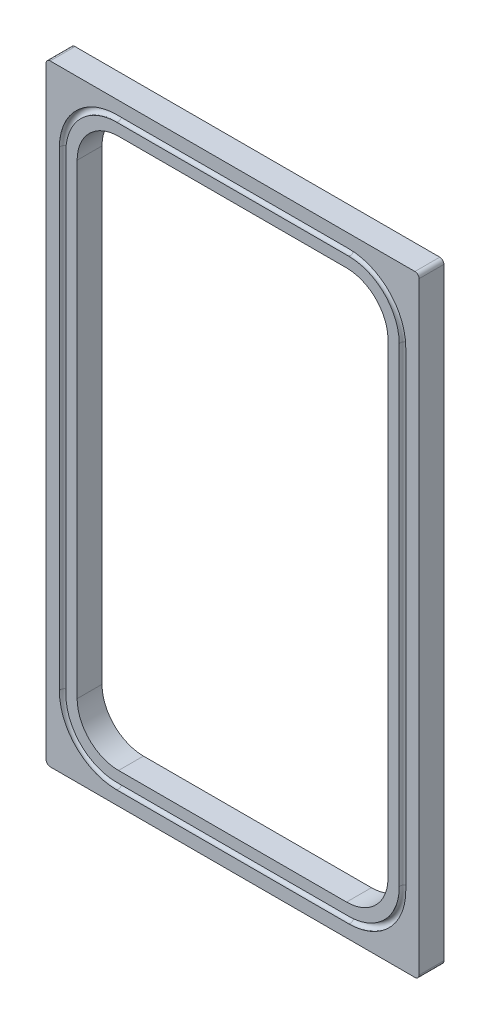
ISO-10303-21;
HEADER;
FILE_DESCRIPTION(('STEP AP214'),'2;1');
FILE_NAME('part.step','',(''),(''),'','','');
FILE_SCHEMA(('AUTOMOTIVE_DESIGN { 1 0 10303 214 1 1 1 1 }'));
ENDSEC;
DATA;
#1=APPLICATION_CONTEXT('core data for automotive mechanical design processes');
#2=APPLICATION_PROTOCOL_DEFINITION('international standard','automotive_design',2000,#1);
#3=PRODUCT_CONTEXT('',#1,'mechanical');
#4=PRODUCT('Part','Part','',(#3));
#5=PRODUCT_RELATED_PRODUCT_CATEGORY('part','',(#4));
#6=PRODUCT_DEFINITION_FORMATION('','',#4);
#7=PRODUCT_DEFINITION_CONTEXT('part definition',#1,'design');
#8=PRODUCT_DEFINITION('design','',#6,#7);
#9=PRODUCT_DEFINITION_SHAPE('','',#8);
#10=(LENGTH_UNIT() NAMED_UNIT(*) SI_UNIT(.MILLI.,.METRE.));
#11=(NAMED_UNIT(*) PLANE_ANGLE_UNIT() SI_UNIT($,.RADIAN.));
#12=(NAMED_UNIT(*) SI_UNIT($,.STERADIAN.) SOLID_ANGLE_UNIT());
#13=UNCERTAINTY_MEASURE_WITH_UNIT(LENGTH_MEASURE(1.E-05),#10,'distance_accuracy_value','');
#14=(GEOMETRIC_REPRESENTATION_CONTEXT(3) GLOBAL_UNCERTAINTY_ASSIGNED_CONTEXT((#13)) GLOBAL_UNIT_ASSIGNED_CONTEXT((#10,
#11,#12)) REPRESENTATION_CONTEXT('',''));
#15=CARTESIAN_POINT('',(0.,0.,0.));
#16=DIRECTION('',(0.,0.,1.));
#17=DIRECTION('',(1.,0.,0.));
#18=AXIS2_PLACEMENT_3D('',#15,#16,#17);
#19=CARTESIAN_POINT('',(90.,147.5,12.));
#20=DIRECTION('',(0.,0.,-1.));
#21=DIRECTION('',(-1.,0.,0.));
#22=AXIS2_PLACEMENT_3D('',#19,#20,#21);
#23=PLANE('',#22);
#24=DIRECTION('',(1.,0.,0.));
#25=VECTOR('',#24,1.);
#26=CARTESIAN_POINT('',(-56.,137.926715219676,12.));
#27=LINE('',#26,#25);
#28=CARTESIAN_POINT('',(-56.,137.926715219676,12.));
#29=VERTEX_POINT('',#28);
#30=CARTESIAN_POINT('',(56.,137.926715219676,12.));
#31=VERTEX_POINT('',#30);
#32=EDGE_CURVE('E224',#29,#31,#27,.T.);
#33=ORIENTED_EDGE('',*,*,#32,.F.);
#34=CARTESIAN_POINT('',(-56.,113.5,12.));
#35=DIRECTION('',(0.,0.,1.));
#36=DIRECTION('',(1.,0.,0.));
#37=AXIS2_PLACEMENT_3D('',#34,#35,#36);
#38=CIRCLE('',#37,24.4267152196757);
#39=CARTESIAN_POINT('',(-80.4267152196758,113.5,12.));
#40=VERTEX_POINT('',#39);
#41=EDGE_CURVE('E450',#40,#29,#38,.F.);
#42=ORIENTED_EDGE('',*,*,#41,.F.);
#43=DIRECTION('',(0.,1.,0.));
#44=VECTOR('',#43,1.);
#45=CARTESIAN_POINT('',(-80.4267152196758,-113.5,12.));
#46=LINE('',#45,#44);
#47=CARTESIAN_POINT('',(-80.4267152196758,-113.5,12.));
#48=VERTEX_POINT('',#47);
#49=EDGE_CURVE('E221',#48,#40,#46,.T.);
#50=ORIENTED_EDGE('',*,*,#49,.F.);
#51=CARTESIAN_POINT('',(-56.,-113.5,12.));
#52=DIRECTION('',(0.,0.,1.));
#53=DIRECTION('',(1.,0.,0.));
#54=AXIS2_PLACEMENT_3D('',#51,#52,#53);
#55=CIRCLE('',#54,24.4267152196758);
#56=CARTESIAN_POINT('',(-56.,-137.926715219676,12.));
#57=VERTEX_POINT('',#56);
#58=EDGE_CURVE('E441',#57,#48,#55,.F.);
#59=ORIENTED_EDGE('',*,*,#58,.F.);
#60=DIRECTION('',(-1.,0.,0.));
#61=VECTOR('',#60,1.);
#62=CARTESIAN_POINT('',(56.,-137.926715219676,12.));
#63=LINE('',#62,#61);
#64=CARTESIAN_POINT('',(56.,-137.926715219676,12.));
#65=VERTEX_POINT('',#64);
#66=EDGE_CURVE('E218',#65,#57,#63,.T.);
#67=ORIENTED_EDGE('',*,*,#66,.F.);
#68=CARTESIAN_POINT('',(56.,-113.5,12.));
#69=DIRECTION('',(0.,0.,1.));
#70=DIRECTION('',(1.,0.,0.));
#71=AXIS2_PLACEMENT_3D('',#68,#69,#70);
#72=CIRCLE('',#71,24.4267152196757);
#73=CARTESIAN_POINT('',(80.4267152196758,-113.5,12.));
#74=VERTEX_POINT('',#73);
#75=EDGE_CURVE('E432',#74,#65,#72,.F.);
#76=ORIENTED_EDGE('',*,*,#75,.F.);
#77=DIRECTION('',(0.,1.,0.));
#78=VECTOR('',#77,1.);
#79=CARTESIAN_POINT('',(80.4267152196758,-113.5,12.));
#80=LINE('',#79,#78);
#81=CARTESIAN_POINT('',(80.4267152196758,113.5,12.));
#82=VERTEX_POINT('',#81);
#83=EDGE_CURVE('E215',#74,#82,#80,.T.);
#84=ORIENTED_EDGE('',*,*,#83,.T.);
#85=CARTESIAN_POINT('',(56.,113.5,12.));
#86=DIRECTION('',(0.,0.,1.));
#87=DIRECTION('',(1.,0.,0.));
#88=AXIS2_PLACEMENT_3D('',#85,#86,#87);
#89=CIRCLE('',#88,24.4267152196758);
#90=EDGE_CURVE('E258',#31,#82,#89,.F.);
#91=ORIENTED_EDGE('',*,*,#90,.F.);
#92=EDGE_LOOP('',(#33,#42,#50,#59,#67,#76,#84,#91));
#93=FACE_BOUND('',#92,.T.);
#94=DIRECTION('',(0.,-1.,0.));
#95=VECTOR('',#94,1.);
#96=CARTESIAN_POINT('',(-74.9999999999999,-132.5,12.));
#97=LINE('',#96,#95);
#98=CARTESIAN_POINT('',(-74.9999999999999,112.5,12.));
#99=VERTEX_POINT('',#98);
#100=CARTESIAN_POINT('',(-74.9999999999999,-112.5,12.));
#101=VERTEX_POINT('',#100);
#102=EDGE_CURVE('E116',#99,#101,#97,.T.);
#103=ORIENTED_EDGE('',*,*,#102,.F.);
#104=CARTESIAN_POINT('',(-54.9999999999999,112.5,12.));
#105=DIRECTION('',(0.,0.,-1.));
#106=DIRECTION('',(-1.,0.,0.));
#107=AXIS2_PLACEMENT_3D('',#104,#105,#106);
#108=CIRCLE('',#107,20.);
#109=CARTESIAN_POINT('',(-54.9999999999999,132.5,12.));
#110=VERTEX_POINT('',#109);
#111=EDGE_CURVE('E11',#99,#110,#108,.T.);
#112=ORIENTED_EDGE('',*,*,#111,.T.);
#113=DIRECTION('',(-1.,0.,0.));
#114=VECTOR('',#113,1.);
#115=CARTESIAN_POINT('',(-74.9999999999999,132.5,12.));
#116=LINE('',#115,#114);
#117=CARTESIAN_POINT('',(55.,132.5,12.));
#118=VERTEX_POINT('',#117);
#119=EDGE_CURVE('E252',#118,#110,#116,.T.);
#120=ORIENTED_EDGE('',*,*,#119,.F.);
#121=CARTESIAN_POINT('',(55.,112.5,12.));
#122=DIRECTION('',(0.,0.,-1.));
#123=DIRECTION('',(-1.,0.,0.));
#124=AXIS2_PLACEMENT_3D('',#121,#122,#123);
#125=CIRCLE('',#124,20.);
#126=CARTESIAN_POINT('',(75.,112.5,12.));
#127=VERTEX_POINT('',#126);
#128=EDGE_CURVE('E233',#118,#127,#125,.T.);
#129=ORIENTED_EDGE('',*,*,#128,.T.);
#130=DIRECTION('',(0.,1.,0.));
#131=VECTOR('',#130,1.);
#132=CARTESIAN_POINT('',(75.,-132.5,12.));
#133=LINE('',#132,#131);
#134=CARTESIAN_POINT('',(75.,-112.5,12.));
#135=VERTEX_POINT('',#134);
#136=EDGE_CURVE('E124',#135,#127,#133,.T.);
#137=ORIENTED_EDGE('',*,*,#136,.F.);
#138=CARTESIAN_POINT('',(55.,-112.5,12.));
#139=DIRECTION('',(0.,0.,-1.));
#140=DIRECTION('',(-1.,0.,0.));
#141=AXIS2_PLACEMENT_3D('',#138,#139,#140);
#142=CIRCLE('',#141,20.);
#143=CARTESIAN_POINT('',(55.,-132.5,12.));
#144=VERTEX_POINT('',#143);
#145=EDGE_CURVE('E107',#135,#144,#142,.T.);
#146=ORIENTED_EDGE('',*,*,#145,.T.);
#147=DIRECTION('',(1.,0.,0.));
#148=VECTOR('',#147,1.);
#149=CARTESIAN_POINT('',(-74.9999999999999,-132.5,12.));
#150=LINE('',#149,#148);
#151=CARTESIAN_POINT('',(-54.9999999999999,-132.5,12.));
#152=VERTEX_POINT('',#151);
#153=EDGE_CURVE('E148',#152,#144,#150,.T.);
#154=ORIENTED_EDGE('',*,*,#153,.F.);
#155=CARTESIAN_POINT('',(-54.9999999999999,-112.5,12.));
#156=DIRECTION('',(0.,0.,-1.));
#157=DIRECTION('',(-1.,0.,0.));
#158=AXIS2_PLACEMENT_3D('',#155,#156,#157);
#159=CIRCLE('',#158,20.);
#160=EDGE_CURVE('E106',#152,#101,#159,.T.);
#161=ORIENTED_EDGE('',*,*,#160,.T.);
#162=EDGE_LOOP('',(#103,#112,#120,#129,#137,#146,#154,#161));
#163=FACE_BOUND('',#162,.T.);
#164=ADVANCED_FACE('F31',(#93,#163),#23,.F.);
#165=DIRECTION('',(0.,-1.,0.));
#166=VECTOR('',#165,1.);
#167=CARTESIAN_POINT('',(-90.,-147.5,12.));
#168=LINE('',#167,#166);
#169=CARTESIAN_POINT('',(-90.,145.5,12.));
#170=VERTEX_POINT('',#169);
#171=CARTESIAN_POINT('',(-90.,-145.5,12.));
#172=VERTEX_POINT('',#171);
#173=EDGE_CURVE('E137',#170,#172,#168,.T.);
#174=ORIENTED_EDGE('',*,*,#173,.T.);
#175=CARTESIAN_POINT('',(-88.,-145.5,12.));
#176=DIRECTION('',(0.,0.,-1.));
#177=DIRECTION('',(-1.,0.,0.));
#178=AXIS2_PLACEMENT_3D('',#175,#176,#177);
#179=CIRCLE('',#178,2.);
#180=CARTESIAN_POINT('',(-88.,-147.5,12.));
#181=VERTEX_POINT('',#180);
#182=EDGE_CURVE('E188',#172,#181,#179,.F.);
#183=ORIENTED_EDGE('',*,*,#182,.T.);
#184=DIRECTION('',(1.,0.,0.));
#185=VECTOR('',#184,1.);
#186=CARTESIAN_POINT('',(-90.,-147.5,12.));
#187=LINE('',#186,#185);
#188=CARTESIAN_POINT('',(88.,-147.5,12.));
#189=VERTEX_POINT('',#188);
#190=EDGE_CURVE('E140',#181,#189,#187,.T.);
#191=ORIENTED_EDGE('',*,*,#190,.T.);
#192=CARTESIAN_POINT('',(88.,-145.5,12.));
#193=DIRECTION('',(0.,0.,-1.));
#194=DIRECTION('',(-1.,0.,0.));
#195=AXIS2_PLACEMENT_3D('',#192,#193,#194);
#196=CIRCLE('',#195,2.);
#197=CARTESIAN_POINT('',(90.,-145.5,12.));
#198=VERTEX_POINT('',#197);
#199=EDGE_CURVE('E185',#189,#198,#196,.F.);
#200=ORIENTED_EDGE('',*,*,#199,.T.);
#201=DIRECTION('',(0.,1.,0.));
#202=VECTOR('',#201,1.);
#203=CARTESIAN_POINT('',(90.,-147.5,12.));
#204=LINE('',#203,#202);
#205=CARTESIAN_POINT('',(90.,145.5,12.));
#206=VERTEX_POINT('',#205);
#207=EDGE_CURVE('E130',#198,#206,#204,.T.);
#208=ORIENTED_EDGE('',*,*,#207,.T.);
#209=CARTESIAN_POINT('',(88.,145.5,12.));
#210=DIRECTION('',(0.,0.,-1.));
#211=DIRECTION('',(-1.,0.,0.));
#212=AXIS2_PLACEMENT_3D('',#209,#210,#211);
#213=CIRCLE('',#212,2.);
#214=CARTESIAN_POINT('',(88.,147.5,12.));
#215=VERTEX_POINT('',#214);
#216=EDGE_CURVE('E179',#206,#215,#213,.F.);
#217=ORIENTED_EDGE('',*,*,#216,.T.);
#218=DIRECTION('',(-1.,0.,0.));
#219=VECTOR('',#218,1.);
#220=CARTESIAN_POINT('',(-90.,147.5,12.));
#221=LINE('',#220,#219);
#222=CARTESIAN_POINT('',(-88.,147.5,12.));
#223=VERTEX_POINT('',#222);
#224=EDGE_CURVE('E133',#215,#223,#221,.T.);
#225=ORIENTED_EDGE('',*,*,#224,.T.);
#226=CARTESIAN_POINT('',(-88.,145.5,12.));
#227=DIRECTION('',(0.,0.,-1.));
#228=DIRECTION('',(-1.,0.,0.));
#229=AXIS2_PLACEMENT_3D('',#226,#227,#228);
#230=CIRCLE('',#229,2.);
#231=EDGE_CURVE('E182',#223,#170,#230,.F.);
#232=ORIENTED_EDGE('',*,*,#231,.T.);
#233=EDGE_LOOP('',(#174,#183,#191,#200,#208,#217,#225,#232));
#234=FACE_BOUND('',#233,.T.);
#235=CARTESIAN_POINT('',(56.,113.5,12.));
#236=DIRECTION('',(0.,0.,-1.));
#237=DIRECTION('',(-1.,0.,0.));
#238=AXIS2_PLACEMENT_3D('',#235,#236,#237);
#239=CIRCLE('',#238,27.5732847803243);
#240=CARTESIAN_POINT('',(83.5732847803243,113.5,12.));
#241=VERTEX_POINT('',#240);
#242=CARTESIAN_POINT('',(56.,141.073284780324,12.));
#243=VERTEX_POINT('',#242);
#244=EDGE_CURVE('E255',#241,#243,#239,.F.);
#245=ORIENTED_EDGE('',*,*,#244,.F.);
#246=DIRECTION('',(0.,1.,0.));
#247=VECTOR('',#246,1.);
#248=CARTESIAN_POINT('',(83.5732847803243,-113.5,12.));
#249=LINE('',#248,#247);
#250=CARTESIAN_POINT('',(83.5732847803243,-113.5,12.));
#251=VERTEX_POINT('',#250);
#252=EDGE_CURVE('E203',#241,#251,#249,.F.);
#253=ORIENTED_EDGE('',*,*,#252,.T.);
#254=CARTESIAN_POINT('',(56.,-113.5,12.));
#255=DIRECTION('',(0.,0.,-1.));
#256=DIRECTION('',(-1.,0.,0.));
#257=AXIS2_PLACEMENT_3D('',#254,#255,#256);
#258=CIRCLE('',#257,27.5732847803243);
#259=CARTESIAN_POINT('',(56.,-141.073284780324,12.));
#260=VERTEX_POINT('',#259);
#261=EDGE_CURVE('E435',#260,#251,#258,.F.);
#262=ORIENTED_EDGE('',*,*,#261,.F.);
#263=DIRECTION('',(-1.,0.,0.));
#264=VECTOR('',#263,1.);
#265=CARTESIAN_POINT('',(56.,-141.073284780324,12.));
#266=LINE('',#265,#264);
#267=CARTESIAN_POINT('',(-56.,-141.073284780324,12.));
#268=VERTEX_POINT('',#267);
#269=EDGE_CURVE('E206',#268,#260,#266,.F.);
#270=ORIENTED_EDGE('',*,*,#269,.F.);
#271=CARTESIAN_POINT('',(-56.,-113.5,12.));
#272=DIRECTION('',(0.,0.,-1.));
#273=DIRECTION('',(-1.,0.,0.));
#274=AXIS2_PLACEMENT_3D('',#271,#272,#273);
#275=CIRCLE('',#274,27.5732847803243);
#276=CARTESIAN_POINT('',(-83.5732847803243,-113.5,12.));
#277=VERTEX_POINT('',#276);
#278=EDGE_CURVE('E448',#277,#268,#275,.F.);
#279=ORIENTED_EDGE('',*,*,#278,.F.);
#280=DIRECTION('',(0.,1.,0.));
#281=VECTOR('',#280,1.);
#282=CARTESIAN_POINT('',(-83.5732847803243,-113.5,12.));
#283=LINE('',#282,#281);
#284=CARTESIAN_POINT('',(-83.5732847803243,113.5,12.));
#285=VERTEX_POINT('',#284);
#286=EDGE_CURVE('E209',#285,#277,#283,.F.);
#287=ORIENTED_EDGE('',*,*,#286,.F.);
#288=CARTESIAN_POINT('',(-56.,113.5,12.));
#289=DIRECTION('',(0.,0.,-1.));
#290=DIRECTION('',(-1.,0.,0.));
#291=AXIS2_PLACEMENT_3D('',#288,#289,#290);
#292=CIRCLE('',#291,27.5732847803243);
#293=CARTESIAN_POINT('',(-56.,141.073284780324,12.));
#294=VERTEX_POINT('',#293);
#295=EDGE_CURVE('E267',#294,#285,#292,.F.);
#296=ORIENTED_EDGE('',*,*,#295,.F.);
#297=DIRECTION('',(1.,0.,0.));
#298=VECTOR('',#297,1.);
#299=CARTESIAN_POINT('',(-56.,141.073284780324,12.));
#300=LINE('',#299,#298);
#301=EDGE_CURVE('E212',#243,#294,#300,.F.);
#302=ORIENTED_EDGE('',*,*,#301,.F.);
#303=EDGE_LOOP('',(#245,#253,#262,#270,#279,#287,#296,#302));
#304=FACE_BOUND('',#303,.T.);
#305=ADVANCED_FACE('F284',(#234,#304),#23,.F.);
#306=CARTESIAN_POINT('',(75.,-132.5,12.));
#307=DIRECTION('',(-1.,0.,0.));
#308=DIRECTION('',(0.,0.,1.));
#309=AXIS2_PLACEMENT_3D('',#306,#307,#308);
#310=PLANE('',#309);
#311=DIRECTION('',(0.,1.,0.));
#312=VECTOR('',#311,1.);
#313=CARTESIAN_POINT('',(75.,-132.5,0.));
#314=LINE('',#313,#312);
#315=CARTESIAN_POINT('',(75.,-112.5,0.));
#316=VERTEX_POINT('',#315);
#317=CARTESIAN_POINT('',(75.,112.5,0.));
#318=VERTEX_POINT('',#317);
#319=EDGE_CURVE('E126',#316,#318,#314,.T.);
#320=ORIENTED_EDGE('',*,*,#319,.F.);
#321=DIRECTION('',(0.,0.,-1.));
#322=VECTOR('',#321,1.);
#323=CARTESIAN_POINT('',(75.,-112.5,9.66434879460932));
#324=LINE('',#323,#322);
#325=EDGE_CURVE('E240',#316,#135,#324,.F.);
#326=ORIENTED_EDGE('',*,*,#325,.T.);
#327=ORIENTED_EDGE('',*,*,#136,.T.);
#328=DIRECTION('',(0.,0.,-1.));
#329=VECTOR('',#328,1.);
#330=CARTESIAN_POINT('',(75.,112.5,0.));
#331=LINE('',#330,#329);
#332=EDGE_CURVE('E227',#127,#318,#331,.T.);
#333=ORIENTED_EDGE('',*,*,#332,.T.);
#334=EDGE_LOOP('',(#320,#326,#327,#333));
#335=FACE_BOUND('',#334,.T.);
#336=ADVANCED_FACE('F290',(#335),#310,.T.);
#337=CARTESIAN_POINT('',(-74.9999999999999,132.5,12.));
#338=DIRECTION('',(0.,-1.,0.));
#339=DIRECTION('',(0.,0.,-1.));
#340=AXIS2_PLACEMENT_3D('',#337,#338,#339);
#341=PLANE('',#340);
#342=ORIENTED_EDGE('',*,*,#119,.T.);
#343=DIRECTION('',(0.,0.,-1.));
#344=VECTOR('',#343,1.);
#345=CARTESIAN_POINT('',(-54.9999999999999,132.5,0.));
#346=LINE('',#345,#344);
#347=CARTESIAN_POINT('',(-54.9999999999999,132.5,0.));
#348=VERTEX_POINT('',#347);
#349=EDGE_CURVE('E117',#110,#348,#346,.T.);
#350=ORIENTED_EDGE('',*,*,#349,.T.);
#351=DIRECTION('',(-1.,0.,0.));
#352=VECTOR('',#351,1.);
#353=CARTESIAN_POINT('',(-74.9999999999999,132.5,0.));
#354=LINE('',#353,#352);
#355=CARTESIAN_POINT('',(55.,132.5,0.));
#356=VERTEX_POINT('',#355);
#357=EDGE_CURVE('E122',#356,#348,#354,.T.);
#358=ORIENTED_EDGE('',*,*,#357,.F.);
#359=DIRECTION('',(0.,0.,-1.));
#360=VECTOR('',#359,1.);
#361=CARTESIAN_POINT('',(55.,132.5,9.66434879460933));
#362=LINE('',#361,#360);
#363=EDGE_CURVE('E230',#356,#118,#362,.F.);
#364=ORIENTED_EDGE('',*,*,#363,.T.);
#365=EDGE_LOOP('',(#342,#350,#358,#364));
#366=FACE_BOUND('',#365,.T.);
#367=ADVANCED_FACE('F274',(#366),#341,.T.);
#368=CARTESIAN_POINT('',(-74.9999999999999,-132.5,12.));
#369=DIRECTION('',(1.,0.,0.));
#370=DIRECTION('',(0.,0.,-1.));
#371=AXIS2_PLACEMENT_3D('',#368,#369,#370);
#372=PLANE('',#371);
#373=ORIENTED_EDGE('',*,*,#102,.T.);
#374=DIRECTION('',(0.,0.,-1.));
#375=VECTOR('',#374,1.);
#376=CARTESIAN_POINT('',(-74.9999999999999,-112.5,0.));
#377=LINE('',#376,#375);
#378=CARTESIAN_POINT('',(-74.9999999999999,-112.5,0.));
#379=VERTEX_POINT('',#378);
#380=EDGE_CURVE('E103',#101,#379,#377,.T.);
#381=ORIENTED_EDGE('',*,*,#380,.T.);
#382=DIRECTION('',(0.,-1.,0.));
#383=VECTOR('',#382,1.);
#384=CARTESIAN_POINT('',(-74.9999999999999,-132.5,0.));
#385=LINE('',#384,#383);
#386=CARTESIAN_POINT('',(-74.9999999999999,112.5,0.));
#387=VERTEX_POINT('',#386);
#388=EDGE_CURVE('E114',#387,#379,#385,.T.);
#389=ORIENTED_EDGE('',*,*,#388,.F.);
#390=DIRECTION('',(0.,0.,-1.));
#391=VECTOR('',#390,1.);
#392=CARTESIAN_POINT('',(-74.9999999999999,112.5,9.66434879460931));
#393=LINE('',#392,#391);
#394=EDGE_CURVE('E118',#387,#99,#393,.F.);
#395=ORIENTED_EDGE('',*,*,#394,.T.);
#396=EDGE_LOOP('',(#373,#381,#389,#395));
#397=FACE_BOUND('',#396,.T.);
#398=ADVANCED_FACE('F112',(#397),#372,.T.);
#399=CARTESIAN_POINT('',(-74.9999999999999,-132.5,12.));
#400=DIRECTION('',(0.,1.,0.));
#401=DIRECTION('',(0.,0.,1.));
#402=AXIS2_PLACEMENT_3D('',#399,#400,#401);
#403=PLANE('',#402);
#404=ORIENTED_EDGE('',*,*,#153,.T.);
#405=DIRECTION('',(0.,0.,-1.));
#406=VECTOR('',#405,1.);
#407=CARTESIAN_POINT('',(55.,-132.5,0.));
#408=LINE('',#407,#406);
#409=CARTESIAN_POINT('',(55.,-132.5,0.));
#410=VERTEX_POINT('',#409);
#411=EDGE_CURVE('E237',#144,#410,#408,.T.);
#412=ORIENTED_EDGE('',*,*,#411,.T.);
#413=DIRECTION('',(1.,0.,0.));
#414=VECTOR('',#413,1.);
#415=CARTESIAN_POINT('',(-74.9999999999999,-132.5,0.));
#416=LINE('',#415,#414);
#417=CARTESIAN_POINT('',(-54.9999999999999,-132.5,0.));
#418=VERTEX_POINT('',#417);
#419=EDGE_CURVE('E121',#418,#410,#416,.T.);
#420=ORIENTED_EDGE('',*,*,#419,.F.);
#421=DIRECTION('',(0.,0.,-1.));
#422=VECTOR('',#421,1.);
#423=CARTESIAN_POINT('',(-54.9999999999999,-132.5,9.66434879460925));
#424=LINE('',#423,#422);
#425=EDGE_CURVE('E65',#418,#152,#424,.F.);
#426=ORIENTED_EDGE('',*,*,#425,.T.);
#427=EDGE_LOOP('',(#404,#412,#420,#426));
#428=FACE_BOUND('',#427,.T.);
#429=ADVANCED_FACE('F299',(#428),#403,.T.);
#430=CARTESIAN_POINT('',(90.,147.5,0.));
#431=DIRECTION('',(0.,0.,-1.));
#432=DIRECTION('',(-1.,0.,0.));
#433=AXIS2_PLACEMENT_3D('',#430,#431,#432);
#434=PLANE('',#433);
#435=DIRECTION('',(1.,0.,0.));
#436=VECTOR('',#435,1.);
#437=CARTESIAN_POINT('',(-90.,-147.5,0.));
#438=LINE('',#437,#436);
#439=CARTESIAN_POINT('',(-88.,-147.5,0.));
#440=VERTEX_POINT('',#439);
#441=CARTESIAN_POINT('',(88.,-147.5,0.));
#442=VERTEX_POINT('',#441);
#443=EDGE_CURVE('E134',#440,#442,#438,.T.);
#444=ORIENTED_EDGE('',*,*,#443,.F.);
#445=CARTESIAN_POINT('',(-88.,-145.5,0.));
#446=DIRECTION('',(0.,0.,-1.));
#447=DIRECTION('',(-1.,0.,0.));
#448=AXIS2_PLACEMENT_3D('',#445,#446,#447);
#449=CIRCLE('',#448,2.);
#450=CARTESIAN_POINT('',(-90.,-145.5,0.));
#451=VERTEX_POINT('',#450);
#452=EDGE_CURVE('E170',#440,#451,#449,.T.);
#453=ORIENTED_EDGE('',*,*,#452,.T.);
#454=DIRECTION('',(0.,-1.,0.));
#455=VECTOR('',#454,1.);
#456=CARTESIAN_POINT('',(-90.,-147.5,0.));
#457=LINE('',#456,#455);
#458=CARTESIAN_POINT('',(-90.,145.5,0.));
#459=VERTEX_POINT('',#458);
#460=EDGE_CURVE('E151',#459,#451,#457,.T.);
#461=ORIENTED_EDGE('',*,*,#460,.F.);
#462=CARTESIAN_POINT('',(-88.,145.5,0.));
#463=DIRECTION('',(0.,0.,-1.));
#464=DIRECTION('',(-1.,0.,0.));
#465=AXIS2_PLACEMENT_3D('',#462,#463,#464);
#466=CIRCLE('',#465,2.);
#467=CARTESIAN_POINT('',(-88.,147.5,0.));
#468=VERTEX_POINT('',#467);
#469=EDGE_CURVE('E164',#459,#468,#466,.T.);
#470=ORIENTED_EDGE('',*,*,#469,.T.);
#471=DIRECTION('',(-1.,0.,0.));
#472=VECTOR('',#471,1.);
#473=CARTESIAN_POINT('',(-90.,147.5,0.));
#474=LINE('',#473,#472);
#475=CARTESIAN_POINT('',(88.,147.5,0.));
#476=VERTEX_POINT('',#475);
#477=EDGE_CURVE('E147',#476,#468,#474,.T.);
#478=ORIENTED_EDGE('',*,*,#477,.F.);
#479=CARTESIAN_POINT('',(88.,145.5,0.));
#480=DIRECTION('',(0.,0.,-1.));
#481=DIRECTION('',(-1.,0.,0.));
#482=AXIS2_PLACEMENT_3D('',#479,#480,#481);
#483=CIRCLE('',#482,2.);
#484=CARTESIAN_POINT('',(90.,145.5,0.));
#485=VERTEX_POINT('',#484);
#486=EDGE_CURVE('E161',#476,#485,#483,.T.);
#487=ORIENTED_EDGE('',*,*,#486,.T.);
#488=DIRECTION('',(0.,1.,0.));
#489=VECTOR('',#488,1.);
#490=CARTESIAN_POINT('',(90.,-147.5,0.));
#491=LINE('',#490,#489);
#492=CARTESIAN_POINT('',(90.,-145.5,0.));
#493=VERTEX_POINT('',#492);
#494=EDGE_CURVE('E144',#493,#485,#491,.T.);
#495=ORIENTED_EDGE('',*,*,#494,.F.);
#496=CARTESIAN_POINT('',(88.,-145.5,0.));
#497=DIRECTION('',(0.,0.,-1.));
#498=DIRECTION('',(-1.,0.,0.));
#499=AXIS2_PLACEMENT_3D('',#496,#497,#498);
#500=CIRCLE('',#499,2.);
#501=EDGE_CURVE('E167',#493,#442,#500,.T.);
#502=ORIENTED_EDGE('',*,*,#501,.T.);
#503=EDGE_LOOP('',(#444,#453,#461,#470,#478,#487,#495,#502));
#504=FACE_BOUND('',#503,.T.);
#505=ORIENTED_EDGE('',*,*,#388,.T.);
#506=CARTESIAN_POINT('',(-54.9999999999999,-112.5,0.));
#507=DIRECTION('',(0.,0.,-1.));
#508=DIRECTION('',(-1.,0.,0.));
#509=AXIS2_PLACEMENT_3D('',#506,#507,#508);
#510=CIRCLE('',#509,20.);
#511=EDGE_CURVE('E99',#379,#418,#510,.F.);
#512=ORIENTED_EDGE('',*,*,#511,.T.);
#513=ORIENTED_EDGE('',*,*,#419,.T.);
#514=CARTESIAN_POINT('',(55.,-112.5,0.));
#515=DIRECTION('',(0.,0.,-1.));
#516=DIRECTION('',(-1.,0.,0.));
#517=AXIS2_PLACEMENT_3D('',#514,#515,#516);
#518=CIRCLE('',#517,20.);
#519=EDGE_CURVE('E245',#410,#316,#518,.F.);
#520=ORIENTED_EDGE('',*,*,#519,.T.);
#521=ORIENTED_EDGE('',*,*,#319,.T.);
#522=CARTESIAN_POINT('',(55.,112.5,0.));
#523=DIRECTION('',(0.,0.,-1.));
#524=DIRECTION('',(-1.,0.,0.));
#525=AXIS2_PLACEMENT_3D('',#522,#523,#524);
#526=CIRCLE('',#525,20.);
#527=EDGE_CURVE('E77',#318,#356,#526,.F.);
#528=ORIENTED_EDGE('',*,*,#527,.T.);
#529=ORIENTED_EDGE('',*,*,#357,.T.);
#530=CARTESIAN_POINT('',(-54.9999999999999,112.5,0.));
#531=DIRECTION('',(0.,0.,-1.));
#532=DIRECTION('',(-1.,0.,0.));
#533=AXIS2_PLACEMENT_3D('',#530,#531,#532);
#534=CIRCLE('',#533,20.);
#535=EDGE_CURVE('E40',#348,#387,#534,.F.);
#536=ORIENTED_EDGE('',*,*,#535,.T.);
#537=EDGE_LOOP('',(#505,#512,#513,#520,#521,#528,#529,#536));
#538=FACE_BOUND('',#537,.T.);
#539=ADVANCED_FACE('F120',(#504,#538),#434,.T.);
#540=CARTESIAN_POINT('',(90.,-147.5,12.));
#541=DIRECTION('',(-1.,0.,0.));
#542=DIRECTION('',(0.,0.,1.));
#543=AXIS2_PLACEMENT_3D('',#540,#541,#542);
#544=PLANE('',#543);
#545=ORIENTED_EDGE('',*,*,#207,.F.);
#546=DIRECTION('',(0.,0.,-1.));
#547=VECTOR('',#546,1.);
#548=CARTESIAN_POINT('',(90.,-145.5,12.));
#549=LINE('',#548,#547);
#550=EDGE_CURVE('E194',#198,#493,#549,.T.);
#551=ORIENTED_EDGE('',*,*,#550,.T.);
#552=ORIENTED_EDGE('',*,*,#494,.T.);
#553=DIRECTION('',(0.,0.,-1.));
#554=VECTOR('',#553,1.);
#555=CARTESIAN_POINT('',(90.,145.5,12.));
#556=LINE('',#555,#554);
#557=EDGE_CURVE('E191',#485,#206,#556,.F.);
#558=ORIENTED_EDGE('',*,*,#557,.T.);
#559=EDGE_LOOP('',(#545,#551,#552,#558));
#560=FACE_BOUND('',#559,.T.);
#561=ADVANCED_FACE('F298',(#560),#544,.F.);
#562=CARTESIAN_POINT('',(-90.,147.5,12.));
#563=DIRECTION('',(0.,-1.,0.));
#564=DIRECTION('',(0.,0.,-1.));
#565=AXIS2_PLACEMENT_3D('',#562,#563,#564);
#566=PLANE('',#565);
#567=ORIENTED_EDGE('',*,*,#477,.T.);
#568=DIRECTION('',(0.,0.,-1.));
#569=VECTOR('',#568,1.);
#570=CARTESIAN_POINT('',(-88.,147.5,12.));
#571=LINE('',#570,#569);
#572=EDGE_CURVE('E200',#468,#223,#571,.F.);
#573=ORIENTED_EDGE('',*,*,#572,.T.);
#574=ORIENTED_EDGE('',*,*,#224,.F.);
#575=DIRECTION('',(0.,0.,-1.));
#576=VECTOR('',#575,1.);
#577=CARTESIAN_POINT('',(88.,147.5,12.));
#578=LINE('',#577,#576);
#579=EDGE_CURVE('E197',#215,#476,#578,.T.);
#580=ORIENTED_EDGE('',*,*,#579,.T.);
#581=EDGE_LOOP('',(#567,#573,#574,#580));
#582=FACE_BOUND('',#581,.T.);
#583=ADVANCED_FACE('F309',(#582),#566,.F.);
#584=CARTESIAN_POINT('',(-90.,-147.5,12.));
#585=DIRECTION('',(1.,0.,0.));
#586=DIRECTION('',(0.,0.,-1.));
#587=AXIS2_PLACEMENT_3D('',#584,#585,#586);
#588=PLANE('',#587);
#589=ORIENTED_EDGE('',*,*,#460,.T.);
#590=DIRECTION('',(0.,0.,-1.));
#591=VECTOR('',#590,1.);
#592=CARTESIAN_POINT('',(-90.,-145.5,12.));
#593=LINE('',#592,#591);
#594=EDGE_CURVE('E176',#451,#172,#593,.F.);
#595=ORIENTED_EDGE('',*,*,#594,.T.);
#596=ORIENTED_EDGE('',*,*,#173,.F.);
#597=DIRECTION('',(0.,0.,-1.));
#598=VECTOR('',#597,1.);
#599=CARTESIAN_POINT('',(-90.,145.5,12.));
#600=LINE('',#599,#598);
#601=EDGE_CURVE('E173',#170,#459,#600,.T.);
#602=ORIENTED_EDGE('',*,*,#601,.T.);
#603=EDGE_LOOP('',(#589,#595,#596,#602));
#604=FACE_BOUND('',#603,.T.);
#605=ADVANCED_FACE('F305',(#604),#588,.F.);
#606=CARTESIAN_POINT('',(-90.,-147.5,12.));
#607=DIRECTION('',(0.,1.,0.));
#608=DIRECTION('',(0.,0.,1.));
#609=AXIS2_PLACEMENT_3D('',#606,#607,#608);
#610=PLANE('',#609);
#611=ORIENTED_EDGE('',*,*,#190,.F.);
#612=DIRECTION('',(0.,0.,-1.));
#613=VECTOR('',#612,1.);
#614=CARTESIAN_POINT('',(-88.,-147.5,12.));
#615=LINE('',#614,#613);
#616=EDGE_CURVE('E158',#181,#440,#615,.T.);
#617=ORIENTED_EDGE('',*,*,#616,.T.);
#618=ORIENTED_EDGE('',*,*,#443,.T.);
#619=DIRECTION('',(0.,0.,-1.));
#620=VECTOR('',#619,1.);
#621=CARTESIAN_POINT('',(88.,-147.5,12.));
#622=LINE('',#621,#620);
#623=EDGE_CURVE('E143',#442,#189,#622,.F.);
#624=ORIENTED_EDGE('',*,*,#623,.T.);
#625=EDGE_LOOP('',(#611,#617,#618,#624));
#626=FACE_BOUND('',#625,.T.);
#627=ADVANCED_FACE('F301',(#626),#610,.F.);
#628=CARTESIAN_POINT('',(-88.,-145.5,12.));
#629=DIRECTION('',(0.,0.,-1.));
#630=DIRECTION('',(-1.,0.,0.));
#631=AXIS2_PLACEMENT_3D('',#628,#629,#630);
#632=CYLINDRICAL_SURFACE('',#631,2.);
#633=ORIENTED_EDGE('',*,*,#182,.F.);
#634=ORIENTED_EDGE('',*,*,#594,.F.);
#635=ORIENTED_EDGE('',*,*,#452,.F.);
#636=ORIENTED_EDGE('',*,*,#616,.F.);
#637=EDGE_LOOP('',(#633,#634,#635,#636));
#638=FACE_BOUND('',#637,.T.);
#639=ADVANCED_FACE('F304',(#638),#632,.T.);
#640=CARTESIAN_POINT('',(88.,-145.5,12.));
#641=DIRECTION('',(0.,0.,-1.));
#642=DIRECTION('',(-1.,0.,0.));
#643=AXIS2_PLACEMENT_3D('',#640,#641,#642);
#644=CYLINDRICAL_SURFACE('',#643,2.);
#645=ORIENTED_EDGE('',*,*,#199,.F.);
#646=ORIENTED_EDGE('',*,*,#623,.F.);
#647=ORIENTED_EDGE('',*,*,#501,.F.);
#648=ORIENTED_EDGE('',*,*,#550,.F.);
#649=EDGE_LOOP('',(#645,#646,#647,#648));
#650=FACE_BOUND('',#649,.T.);
#651=ADVANCED_FACE('F319',(#650),#644,.T.);
#652=CARTESIAN_POINT('',(-88.,145.5,12.));
#653=DIRECTION('',(0.,0.,-1.));
#654=DIRECTION('',(-1.,0.,0.));
#655=AXIS2_PLACEMENT_3D('',#652,#653,#654);
#656=CYLINDRICAL_SURFACE('',#655,2.);
#657=ORIENTED_EDGE('',*,*,#231,.F.);
#658=ORIENTED_EDGE('',*,*,#572,.F.);
#659=ORIENTED_EDGE('',*,*,#469,.F.);
#660=ORIENTED_EDGE('',*,*,#601,.F.);
#661=EDGE_LOOP('',(#657,#658,#659,#660));
#662=FACE_BOUND('',#661,.T.);
#663=ADVANCED_FACE('F323',(#662),#656,.T.);
#664=CARTESIAN_POINT('',(88.,145.5,12.));
#665=DIRECTION('',(0.,0.,-1.));
#666=DIRECTION('',(-1.,0.,0.));
#667=AXIS2_PLACEMENT_3D('',#664,#665,#666);
#668=CYLINDRICAL_SURFACE('',#667,2.);
#669=ORIENTED_EDGE('',*,*,#216,.F.);
#670=ORIENTED_EDGE('',*,*,#557,.F.);
#671=ORIENTED_EDGE('',*,*,#486,.F.);
#672=ORIENTED_EDGE('',*,*,#579,.F.);
#673=EDGE_LOOP('',(#669,#670,#671,#672));
#674=FACE_BOUND('',#673,.T.);
#675=ADVANCED_FACE('F327',(#674),#668,.T.);
#676=CARTESIAN_POINT('',(-56.,139.5,11.2));
#677=DIRECTION('',(1.,0.,0.));
#678=DIRECTION('',(0.,0.,-1.));
#679=AXIS2_PLACEMENT_3D('',#676,#677,#678);
#680=CYLINDRICAL_SURFACE('',#679,1.765);
#681=ORIENTED_EDGE('',*,*,#301,.T.);
#682=CARTESIAN_POINT('',(-56.,139.5,11.2));
#683=DIRECTION('',(-1.,0.,0.));
#684=DIRECTION('',(0.,0.,1.));
#685=AXIS2_PLACEMENT_3D('',#682,#683,#684);
#686=CIRCLE('',#685,1.765);
#687=EDGE_CURVE('E460',#294,#29,#686,.T.);
#688=ORIENTED_EDGE('',*,*,#687,.T.);
#689=ORIENTED_EDGE('',*,*,#32,.T.);
#690=CARTESIAN_POINT('',(56.,139.5,11.2));
#691=DIRECTION('',(-1.,0.,0.));
#692=DIRECTION('',(0.,0.,1.));
#693=AXIS2_PLACEMENT_3D('',#690,#691,#692);
#694=CIRCLE('',#693,1.765);
#695=EDGE_CURVE('E443',#243,#31,#694,.T.);
#696=ORIENTED_EDGE('',*,*,#695,.F.);
#697=EDGE_LOOP('',(#681,#688,#689,#696));
#698=FACE_BOUND('',#697,.T.);
#699=ADVANCED_FACE('F331',(#698),#680,.F.);
#700=CARTESIAN_POINT('',(-82.,-113.5,11.2));
#701=DIRECTION('',(0.,1.,0.));
#702=DIRECTION('',(0.,0.,1.));
#703=AXIS2_PLACEMENT_3D('',#700,#701,#702);
#704=CYLINDRICAL_SURFACE('',#703,1.765);
#705=ORIENTED_EDGE('',*,*,#286,.T.);
#706=CARTESIAN_POINT('',(-82.,-113.5,11.2));
#707=DIRECTION('',(0.,-1.,0.));
#708=DIRECTION('',(0.,0.,1.));
#709=AXIS2_PLACEMENT_3D('',#706,#707,#708);
#710=CIRCLE('',#709,1.765);
#711=EDGE_CURVE('E469',#277,#48,#710,.T.);
#712=ORIENTED_EDGE('',*,*,#711,.T.);
#713=ORIENTED_EDGE('',*,*,#49,.T.);
#714=CARTESIAN_POINT('',(-82.,113.5,11.2));
#715=DIRECTION('',(0.,-1.,0.));
#716=DIRECTION('',(0.,0.,1.));
#717=AXIS2_PLACEMENT_3D('',#714,#715,#716);
#718=CIRCLE('',#717,1.765);
#719=EDGE_CURVE('E457',#285,#40,#718,.T.);
#720=ORIENTED_EDGE('',*,*,#719,.F.);
#721=EDGE_LOOP('',(#705,#712,#713,#720));
#722=FACE_BOUND('',#721,.T.);
#723=ADVANCED_FACE('F465',(#722),#704,.F.);
#724=CARTESIAN_POINT('',(56.,-139.5,11.2));
#725=DIRECTION('',(-1.,0.,0.));
#726=DIRECTION('',(0.,0.,1.));
#727=AXIS2_PLACEMENT_3D('',#724,#725,#726);
#728=CYLINDRICAL_SURFACE('',#727,1.765);
#729=ORIENTED_EDGE('',*,*,#269,.T.);
#730=CARTESIAN_POINT('',(56.,-139.5,11.2));
#731=DIRECTION('',(1.,0.,0.));
#732=DIRECTION('',(0.,0.,1.));
#733=AXIS2_PLACEMENT_3D('',#730,#731,#732);
#734=CIRCLE('',#733,1.765);
#735=EDGE_CURVE('E436',#260,#65,#734,.T.);
#736=ORIENTED_EDGE('',*,*,#735,.T.);
#737=ORIENTED_EDGE('',*,*,#66,.T.);
#738=CARTESIAN_POINT('',(-56.,-139.5,11.2));
#739=DIRECTION('',(1.,0.,0.));
#740=DIRECTION('',(0.,0.,1.));
#741=AXIS2_PLACEMENT_3D('',#738,#739,#740);
#742=CIRCLE('',#741,1.765);
#743=EDGE_CURVE('E477',#268,#57,#742,.T.);
#744=ORIENTED_EDGE('',*,*,#743,.F.);
#745=EDGE_LOOP('',(#729,#736,#737,#744));
#746=FACE_BOUND('',#745,.T.);
#747=ADVANCED_FACE('F479',(#746),#728,.F.);
#748=CARTESIAN_POINT('',(82.,-113.5,11.2));
#749=DIRECTION('',(0.,1.,0.));
#750=DIRECTION('',(-1.,0.,0.));
#751=AXIS2_PLACEMENT_3D('',#748,#749,#750);
#752=CYLINDRICAL_SURFACE('',#751,1.765);
#753=CARTESIAN_POINT('',(82.,-113.5,11.2));
#754=DIRECTION('',(0.,1.,0.));
#755=DIRECTION('',(0.,0.,1.));
#756=AXIS2_PLACEMENT_3D('',#753,#754,#755);
#757=CIRCLE('',#756,1.765);
#758=EDGE_CURVE('E425',#251,#74,#757,.T.);
#759=ORIENTED_EDGE('',*,*,#758,.F.);
#760=ORIENTED_EDGE('',*,*,#252,.F.);
#761=CARTESIAN_POINT('',(82.,113.5,11.2));
#762=DIRECTION('',(0.,1.,0.));
#763=DIRECTION('',(0.,0.,1.));
#764=AXIS2_PLACEMENT_3D('',#761,#762,#763);
#765=CIRCLE('',#764,1.765);
#766=EDGE_CURVE('E427',#241,#82,#765,.T.);
#767=ORIENTED_EDGE('',*,*,#766,.T.);
#768=ORIENTED_EDGE('',*,*,#83,.F.);
#769=EDGE_LOOP('',(#759,#760,#767,#768));
#770=FACE_BOUND('',#769,.T.);
#771=ADVANCED_FACE('F424',(#770),#752,.F.);
#772=CARTESIAN_POINT('',(56.,113.5,11.2));
#773=DIRECTION('',(0.,0.,-1.));
#774=DIRECTION('',(-1.,0.,0.));
#775=AXIS2_PLACEMENT_3D('',#772,#773,#774);
#776=TOROIDAL_SURFACE('',#775,26.,1.765);
#777=ORIENTED_EDGE('',*,*,#244,.T.);
#778=ORIENTED_EDGE('',*,*,#695,.T.);
#779=ORIENTED_EDGE('',*,*,#90,.T.);
#780=ORIENTED_EDGE('',*,*,#766,.F.);
#781=EDGE_LOOP('',(#777,#778,#779,#780));
#782=FACE_BOUND('',#781,.T.);
#783=ADVANCED_FACE('F484',(#782),#776,.F.);
#784=CARTESIAN_POINT('',(-56.,113.5,11.2));
#785=DIRECTION('',(0.,0.,-1.));
#786=DIRECTION('',(-1.,0.,0.));
#787=AXIS2_PLACEMENT_3D('',#784,#785,#786);
#788=TOROIDAL_SURFACE('',#787,26.,1.765);
#789=ORIENTED_EDGE('',*,*,#295,.T.);
#790=ORIENTED_EDGE('',*,*,#719,.T.);
#791=ORIENTED_EDGE('',*,*,#41,.T.);
#792=ORIENTED_EDGE('',*,*,#687,.F.);
#793=EDGE_LOOP('',(#789,#790,#791,#792));
#794=FACE_BOUND('',#793,.T.);
#795=ADVANCED_FACE('F456',(#794),#788,.F.);
#796=CARTESIAN_POINT('',(-56.,-113.5,11.2));
#797=DIRECTION('',(0.,0.,-1.));
#798=DIRECTION('',(-1.,0.,0.));
#799=AXIS2_PLACEMENT_3D('',#796,#797,#798);
#800=TOROIDAL_SURFACE('',#799,26.,1.765);
#801=ORIENTED_EDGE('',*,*,#278,.T.);
#802=ORIENTED_EDGE('',*,*,#743,.T.);
#803=ORIENTED_EDGE('',*,*,#58,.T.);
#804=ORIENTED_EDGE('',*,*,#711,.F.);
#805=EDGE_LOOP('',(#801,#802,#803,#804));
#806=FACE_BOUND('',#805,.T.);
#807=ADVANCED_FACE('F476',(#806),#800,.F.);
#808=CARTESIAN_POINT('',(56.,-113.5,11.2));
#809=DIRECTION('',(0.,0.,-1.));
#810=DIRECTION('',(-1.,0.,0.));
#811=AXIS2_PLACEMENT_3D('',#808,#809,#810);
#812=TOROIDAL_SURFACE('',#811,26.,1.765);
#813=ORIENTED_EDGE('',*,*,#261,.T.);
#814=ORIENTED_EDGE('',*,*,#758,.T.);
#815=ORIENTED_EDGE('',*,*,#75,.T.);
#816=ORIENTED_EDGE('',*,*,#735,.F.);
#817=EDGE_LOOP('',(#813,#814,#815,#816));
#818=FACE_BOUND('',#817,.T.);
#819=ADVANCED_FACE('F336',(#818),#812,.F.);
#820=CARTESIAN_POINT('',(55.,112.5,12.));
#821=DIRECTION('',(0.,0.,1.));
#822=DIRECTION('',(1.,0.,0.));
#823=AXIS2_PLACEMENT_3D('',#820,#821,#822);
#824=CYLINDRICAL_SURFACE('',#823,20.);
#825=ORIENTED_EDGE('',*,*,#128,.F.);
#826=ORIENTED_EDGE('',*,*,#363,.F.);
#827=ORIENTED_EDGE('',*,*,#527,.F.);
#828=ORIENTED_EDGE('',*,*,#332,.F.);
#829=EDGE_LOOP('',(#825,#826,#827,#828));
#830=FACE_BOUND('',#829,.T.);
#831=ADVANCED_FACE('F333',(#830),#824,.F.);
#832=CARTESIAN_POINT('',(55.,-112.5,12.));
#833=DIRECTION('',(0.,0.,1.));
#834=DIRECTION('',(1.,0.,0.));
#835=AXIS2_PLACEMENT_3D('',#832,#833,#834);
#836=CYLINDRICAL_SURFACE('',#835,20.);
#837=ORIENTED_EDGE('',*,*,#145,.F.);
#838=ORIENTED_EDGE('',*,*,#325,.F.);
#839=ORIENTED_EDGE('',*,*,#519,.F.);
#840=ORIENTED_EDGE('',*,*,#411,.F.);
#841=EDGE_LOOP('',(#837,#838,#839,#840));
#842=FACE_BOUND('',#841,.T.);
#843=ADVANCED_FACE('F282',(#842),#836,.F.);
#844=CARTESIAN_POINT('',(-54.9999999999999,-112.5,12.));
#845=DIRECTION('',(0.,0.,1.));
#846=DIRECTION('',(1.,0.,0.));
#847=AXIS2_PLACEMENT_3D('',#844,#845,#846);
#848=CYLINDRICAL_SURFACE('',#847,20.);
#849=ORIENTED_EDGE('',*,*,#160,.F.);
#850=ORIENTED_EDGE('',*,*,#425,.F.);
#851=ORIENTED_EDGE('',*,*,#511,.F.);
#852=ORIENTED_EDGE('',*,*,#380,.F.);
#853=EDGE_LOOP('',(#849,#850,#851,#852));
#854=FACE_BOUND('',#853,.T.);
#855=ADVANCED_FACE('F102',(#854),#848,.F.);
#856=CARTESIAN_POINT('',(-54.9999999999999,112.5,12.));
#857=DIRECTION('',(0.,0.,1.));
#858=DIRECTION('',(1.,0.,0.));
#859=AXIS2_PLACEMENT_3D('',#856,#857,#858);
#860=CYLINDRICAL_SURFACE('',#859,20.);
#861=ORIENTED_EDGE('',*,*,#111,.F.);
#862=ORIENTED_EDGE('',*,*,#394,.F.);
#863=ORIENTED_EDGE('',*,*,#535,.F.);
#864=ORIENTED_EDGE('',*,*,#349,.F.);
#865=EDGE_LOOP('',(#861,#862,#863,#864));
#866=FACE_BOUND('',#865,.T.);
#867=ADVANCED_FACE('F33',(#866),#860,.F.);
#868=CLOSED_SHELL('',(#164,#305,#336,#367,#398,#429,#539,#561,#583,#605,#627,#639,#651,#663,
#675,#699,#723,#747,#771,#783,#795,#807,#819,#831,#843,#855,#867));
#869=MANIFOLD_SOLID_BREP('B2',#868);
#870=ADVANCED_BREP_SHAPE_REPRESENTATION('',(#18,#869),#14);
#871=SHAPE_DEFINITION_REPRESENTATION(#9,#870);
ENDSEC;
END-ISO-10303-21;
